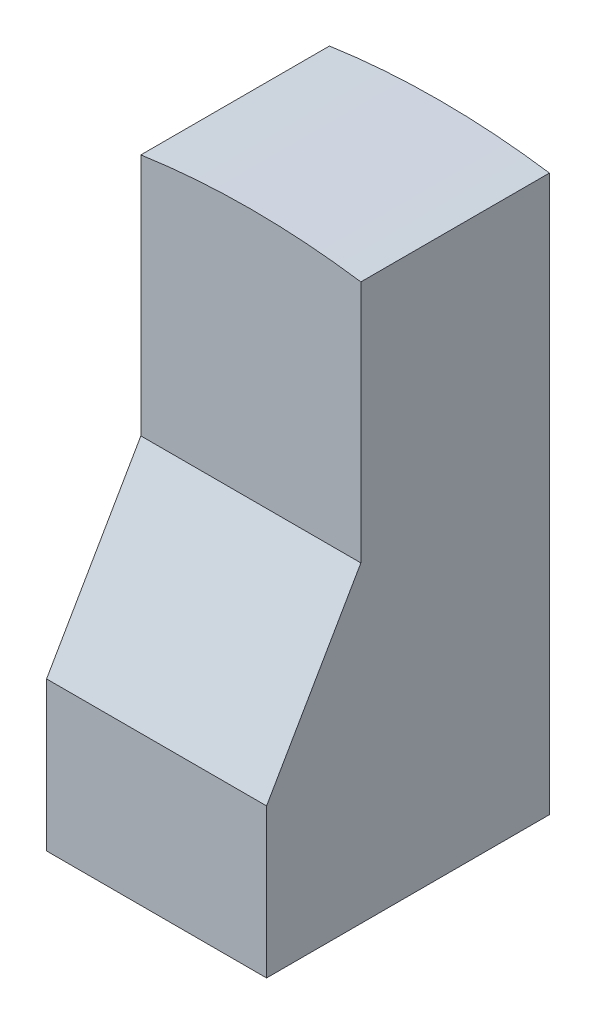
ISO-10303-21;
HEADER;
FILE_DESCRIPTION(('STEP AP214'),'2;1');
FILE_NAME('part.step','',(''),(''),'','','');
FILE_SCHEMA(('AUTOMOTIVE_DESIGN { 1 0 10303 214 1 1 1 1 }'));
ENDSEC;
DATA;
#1=APPLICATION_CONTEXT('core data for automotive mechanical design processes');
#2=APPLICATION_PROTOCOL_DEFINITION('international standard','automotive_design',2000,#1);
#3=PRODUCT_CONTEXT('',#1,'mechanical');
#4=PRODUCT('Part','Part','',(#3));
#5=PRODUCT_RELATED_PRODUCT_CATEGORY('part','',(#4));
#6=PRODUCT_DEFINITION_FORMATION('','',#4);
#7=PRODUCT_DEFINITION_CONTEXT('part definition',#1,'design');
#8=PRODUCT_DEFINITION('design','',#6,#7);
#9=PRODUCT_DEFINITION_SHAPE('','',#8);
#10=(LENGTH_UNIT() NAMED_UNIT(*) SI_UNIT(.MILLI.,.METRE.));
#11=(NAMED_UNIT(*) PLANE_ANGLE_UNIT() SI_UNIT($,.RADIAN.));
#12=(NAMED_UNIT(*) SI_UNIT($,.STERADIAN.) SOLID_ANGLE_UNIT());
#13=UNCERTAINTY_MEASURE_WITH_UNIT(LENGTH_MEASURE(1.E-05),#10,'distance_accuracy_value','');
#14=(GEOMETRIC_REPRESENTATION_CONTEXT(3) GLOBAL_UNCERTAINTY_ASSIGNED_CONTEXT((#13)) GLOBAL_UNIT_ASSIGNED_CONTEXT((#10,
#11,#12)) REPRESENTATION_CONTEXT('',''));
#15=CARTESIAN_POINT('',(0.,0.,0.));
#16=DIRECTION('',(0.,0.,1.));
#17=DIRECTION('',(1.,0.,0.));
#18=AXIS2_PLACEMENT_3D('',#15,#16,#17);
#19=CARTESIAN_POINT('',(0.,0.,22.5));
#20=DIRECTION('',(0.,0.,-1.));
#21=DIRECTION('',(-1.,0.,0.));
#22=AXIS2_PLACEMENT_3D('',#19,#20,#21);
#23=CYLINDRICAL_SURFACE('',#22,120.);
#24=CARTESIAN_POINT('',(0.,0.,7.49999999999998));
#25=DIRECTION('',(0.,0.,-1.));
#26=DIRECTION('',(0.,1.,0.));
#27=AXIS2_PLACEMENT_3D('',#24,#25,#26);
#28=CIRCLE('',#27,120.);
#29=CARTESIAN_POINT('',(-17.5,118.717100705838,7.5));
#30=VERTEX_POINT('',#29);
#31=CARTESIAN_POINT('',(17.5,118.717100705838,7.5));
#32=VERTEX_POINT('',#31);
#33=EDGE_CURVE('E85',#30,#32,#28,.T.);
#34=ORIENTED_EDGE('',*,*,#33,.T.);
#35=DIRECTION('',(0.,0.,-1.));
#36=VECTOR('',#35,1.);
#37=CARTESIAN_POINT('',(17.5,118.717100705838,22.5));
#38=LINE('',#37,#36);
#39=CARTESIAN_POINT('',(17.5,118.717100705838,-22.5));
#40=VERTEX_POINT('',#39);
#41=EDGE_CURVE('E78',#32,#40,#38,.T.);
#42=ORIENTED_EDGE('',*,*,#41,.T.);
#43=CARTESIAN_POINT('',(0.,0.,-22.5));
#44=DIRECTION('',(0.,0.,1.));
#45=DIRECTION('',(-1.,0.,0.));
#46=AXIS2_PLACEMENT_3D('',#43,#44,#45);
#47=CIRCLE('',#46,120.);
#48=CARTESIAN_POINT('',(-17.5,118.717100705838,-22.5));
#49=VERTEX_POINT('',#48);
#50=EDGE_CURVE('E82',#40,#49,#47,.T.);
#51=ORIENTED_EDGE('',*,*,#50,.T.);
#52=DIRECTION('',(0.,0.,-1.));
#53=VECTOR('',#52,1.);
#54=CARTESIAN_POINT('',(-17.5,118.717100705838,22.5));
#55=LINE('',#54,#53);
#56=EDGE_CURVE('E11',#30,#49,#55,.T.);
#57=ORIENTED_EDGE('',*,*,#56,.F.);
#58=EDGE_LOOP('',(#34,#42,#51,#57));
#59=FACE_BOUND('',#58,.T.);
#60=ADVANCED_FACE('F36',(#59),#23,.T.);
#61=CARTESIAN_POINT('',(-17.5,118.717100705838,22.5));
#62=DIRECTION('',(1.,0.,0.));
#63=DIRECTION('',(0.,1.,0.));
#64=AXIS2_PLACEMENT_3D('',#61,#62,#63);
#65=PLANE('',#64);
#66=DIRECTION('',(0.,0.866025403784442,-0.499999999999995));
#67=VECTOR('',#66,1.);
#68=CARTESIAN_POINT('',(-17.5,54.0192378864664,22.5));
#69=LINE('',#68,#67);
#70=CARTESIAN_POINT('',(-17.5,54.0192378864665,22.5));
#71=VERTEX_POINT('',#70);
#72=CARTESIAN_POINT('',(-17.5,80.,7.49999999999999));
#73=VERTEX_POINT('',#72);
#74=EDGE_CURVE('E50',#71,#73,#69,.T.);
#75=ORIENTED_EDGE('',*,*,#74,.T.);
#76=DIRECTION('',(0.,1.,0.));
#77=VECTOR('',#76,1.);
#78=CARTESIAN_POINT('',(-17.5,120.,7.5));
#79=LINE('',#78,#77);
#80=EDGE_CURVE('E122',#73,#30,#79,.T.);
#81=ORIENTED_EDGE('',*,*,#80,.T.);
#82=ORIENTED_EDGE('',*,*,#56,.T.);
#83=DIRECTION('',(0.,-1.,0.));
#84=VECTOR('',#83,1.);
#85=CARTESIAN_POINT('',(-17.5,118.717100705838,-22.5));
#86=LINE('',#85,#84);
#87=CARTESIAN_POINT('',(-17.5,30.31,-22.5));
#88=VERTEX_POINT('',#87);
#89=EDGE_CURVE('E104',#49,#88,#86,.T.);
#90=ORIENTED_EDGE('',*,*,#89,.T.);
#91=DIRECTION('',(0.,0.,-1.));
#92=VECTOR('',#91,1.);
#93=CARTESIAN_POINT('',(-17.5,30.31,22.5));
#94=LINE('',#93,#92);
#95=CARTESIAN_POINT('',(-17.5,30.31,22.5));
#96=VERTEX_POINT('',#95);
#97=EDGE_CURVE('E43',#96,#88,#94,.T.);
#98=ORIENTED_EDGE('',*,*,#97,.F.);
#99=DIRECTION('',(0.,-1.,0.));
#100=VECTOR('',#99,1.);
#101=CARTESIAN_POINT('',(-17.5,118.717100705838,22.5));
#102=LINE('',#101,#100);
#103=EDGE_CURVE('E99',#71,#96,#102,.T.);
#104=ORIENTED_EDGE('',*,*,#103,.F.);
#105=EDGE_LOOP('',(#75,#81,#82,#90,#98,#104));
#106=FACE_BOUND('',#105,.T.);
#107=ADVANCED_FACE('F119',(#106),#65,.F.);
#108=CARTESIAN_POINT('',(-17.5,30.31,22.5));
#109=DIRECTION('',(0.,1.,0.));
#110=DIRECTION('',(-1.,0.,0.));
#111=AXIS2_PLACEMENT_3D('',#108,#109,#110);
#112=PLANE('',#111);
#113=DIRECTION('',(1.,0.,0.));
#114=VECTOR('',#113,1.);
#115=CARTESIAN_POINT('',(-17.5,30.31,-22.5));
#116=LINE('',#115,#114);
#117=CARTESIAN_POINT('',(17.5,30.31,-22.5));
#118=VERTEX_POINT('',#117);
#119=EDGE_CURVE('E100',#88,#118,#116,.T.);
#120=ORIENTED_EDGE('',*,*,#119,.T.);
#121=DIRECTION('',(0.,0.,-1.));
#122=VECTOR('',#121,1.);
#123=CARTESIAN_POINT('',(17.5,30.31,22.5));
#124=LINE('',#123,#122);
#125=CARTESIAN_POINT('',(17.5,30.31,22.5));
#126=VERTEX_POINT('',#125);
#127=EDGE_CURVE('E89',#126,#118,#124,.T.);
#128=ORIENTED_EDGE('',*,*,#127,.F.);
#129=DIRECTION('',(1.,0.,0.));
#130=VECTOR('',#129,1.);
#131=CARTESIAN_POINT('',(-17.5,30.31,22.5));
#132=LINE('',#131,#130);
#133=EDGE_CURVE('E59',#96,#126,#132,.T.);
#134=ORIENTED_EDGE('',*,*,#133,.F.);
#135=ORIENTED_EDGE('',*,*,#97,.T.);
#136=EDGE_LOOP('',(#120,#128,#134,#135));
#137=FACE_BOUND('',#136,.T.);
#138=ADVANCED_FACE('F116',(#137),#112,.F.);
#139=CARTESIAN_POINT('',(17.5,118.717100705838,22.5));
#140=DIRECTION('',(-1.,0.,0.));
#141=DIRECTION('',(0.,-1.,0.));
#142=AXIS2_PLACEMENT_3D('',#139,#140,#141);
#143=PLANE('',#142);
#144=ORIENTED_EDGE('',*,*,#41,.F.);
#145=DIRECTION('',(0.,1.,0.));
#146=VECTOR('',#145,1.);
#147=CARTESIAN_POINT('',(17.5,120.,7.5));
#148=LINE('',#147,#146);
#149=CARTESIAN_POINT('',(17.5,80.,7.49999999999999));
#150=VERTEX_POINT('',#149);
#151=EDGE_CURVE('E140',#150,#32,#148,.T.);
#152=ORIENTED_EDGE('',*,*,#151,.F.);
#153=DIRECTION('',(0.,0.866025403784442,-0.499999999999995));
#154=VECTOR('',#153,1.);
#155=CARTESIAN_POINT('',(17.5,54.0192378864664,22.5));
#156=LINE('',#155,#154);
#157=CARTESIAN_POINT('',(17.5,54.0192378864664,22.5));
#158=VERTEX_POINT('',#157);
#159=EDGE_CURVE('E135',#158,#150,#156,.T.);
#160=ORIENTED_EDGE('',*,*,#159,.F.);
#161=DIRECTION('',(0.,1.,0.));
#162=VECTOR('',#161,1.);
#163=CARTESIAN_POINT('',(17.5,118.717100705838,22.5));
#164=LINE('',#163,#162);
#165=EDGE_CURVE('E90',#126,#158,#164,.T.);
#166=ORIENTED_EDGE('',*,*,#165,.F.);
#167=ORIENTED_EDGE('',*,*,#127,.T.);
#168=DIRECTION('',(0.,1.,0.));
#169=VECTOR('',#168,1.);
#170=CARTESIAN_POINT('',(17.5,118.717100705838,-22.5));
#171=LINE('',#170,#169);
#172=EDGE_CURVE('E94',#118,#40,#171,.T.);
#173=ORIENTED_EDGE('',*,*,#172,.T.);
#174=EDGE_LOOP('',(#144,#152,#160,#166,#167,#173));
#175=FACE_BOUND('',#174,.T.);
#176=ADVANCED_FACE('F95',(#175),#143,.F.);
#177=CARTESIAN_POINT('',(0.,0.,22.5));
#178=DIRECTION('',(0.,0.,-1.));
#179=DIRECTION('',(-1.,0.,0.));
#180=AXIS2_PLACEMENT_3D('',#177,#178,#179);
#181=PLANE('',#180);
#182=ORIENTED_EDGE('',*,*,#165,.T.);
#183=DIRECTION('',(1.,0.,0.));
#184=VECTOR('',#183,1.);
#185=CARTESIAN_POINT('',(-17.5,54.0192378864664,22.5));
#186=LINE('',#185,#184);
#187=EDGE_CURVE('E136',#71,#158,#186,.T.);
#188=ORIENTED_EDGE('',*,*,#187,.F.);
#189=ORIENTED_EDGE('',*,*,#103,.T.);
#190=ORIENTED_EDGE('',*,*,#133,.T.);
#191=EDGE_LOOP('',(#182,#188,#189,#190));
#192=FACE_BOUND('',#191,.T.);
#193=ADVANCED_FACE('F146',(#192),#181,.F.);
#194=CARTESIAN_POINT('',(0.,0.,-22.5));
#195=DIRECTION('',(0.,0.,-1.));
#196=DIRECTION('',(-1.,0.,0.));
#197=AXIS2_PLACEMENT_3D('',#194,#195,#196);
#198=PLANE('',#197);
#199=ORIENTED_EDGE('',*,*,#50,.F.);
#200=ORIENTED_EDGE('',*,*,#172,.F.);
#201=ORIENTED_EDGE('',*,*,#119,.F.);
#202=ORIENTED_EDGE('',*,*,#89,.F.);
#203=EDGE_LOOP('',(#199,#200,#201,#202));
#204=FACE_BOUND('',#203,.T.);
#205=ADVANCED_FACE('F103',(#204),#198,.T.);
#206=CARTESIAN_POINT('',(-17.5,120.,7.5));
#207=DIRECTION('',(0.,0.,-1.));
#208=DIRECTION('',(0.,1.,0.));
#209=AXIS2_PLACEMENT_3D('',#206,#207,#208);
#210=PLANE('',#209);
#211=ORIENTED_EDGE('',*,*,#33,.F.);
#212=ORIENTED_EDGE('',*,*,#80,.F.);
#213=DIRECTION('',(1.,0.,0.));
#214=VECTOR('',#213,1.);
#215=CARTESIAN_POINT('',(-17.5,80.,7.49999999999999));
#216=LINE('',#215,#214);
#217=EDGE_CURVE('E107',#73,#150,#216,.T.);
#218=ORIENTED_EDGE('',*,*,#217,.T.);
#219=ORIENTED_EDGE('',*,*,#151,.T.);
#220=EDGE_LOOP('',(#211,#212,#218,#219));
#221=FACE_BOUND('',#220,.T.);
#222=ADVANCED_FACE('F138',(#221),#210,.F.);
#223=CARTESIAN_POINT('',(-17.5,54.0192378864664,22.5));
#224=DIRECTION('',(0.,-0.499999999999995,-0.866025403784442));
#225=DIRECTION('',(0.,0.866025403784442,-0.499999999999995));
#226=AXIS2_PLACEMENT_3D('',#223,#224,#225);
#227=PLANE('',#226);
#228=ORIENTED_EDGE('',*,*,#159,.T.);
#229=ORIENTED_EDGE('',*,*,#217,.F.);
#230=ORIENTED_EDGE('',*,*,#74,.F.);
#231=ORIENTED_EDGE('',*,*,#187,.T.);
#232=EDGE_LOOP('',(#228,#229,#230,#231));
#233=FACE_BOUND('',#232,.T.);
#234=ADVANCED_FACE('F133',(#233),#227,.F.);
#235=CLOSED_SHELL('',(#60,#107,#138,#176,#193,#205,#222,#234));
#236=MANIFOLD_SOLID_BREP('B2',#235);
#237=ADVANCED_BREP_SHAPE_REPRESENTATION('',(#18,#236),#14);
#238=SHAPE_DEFINITION_REPRESENTATION(#9,#237);
ENDSEC;
END-ISO-10303-21;
